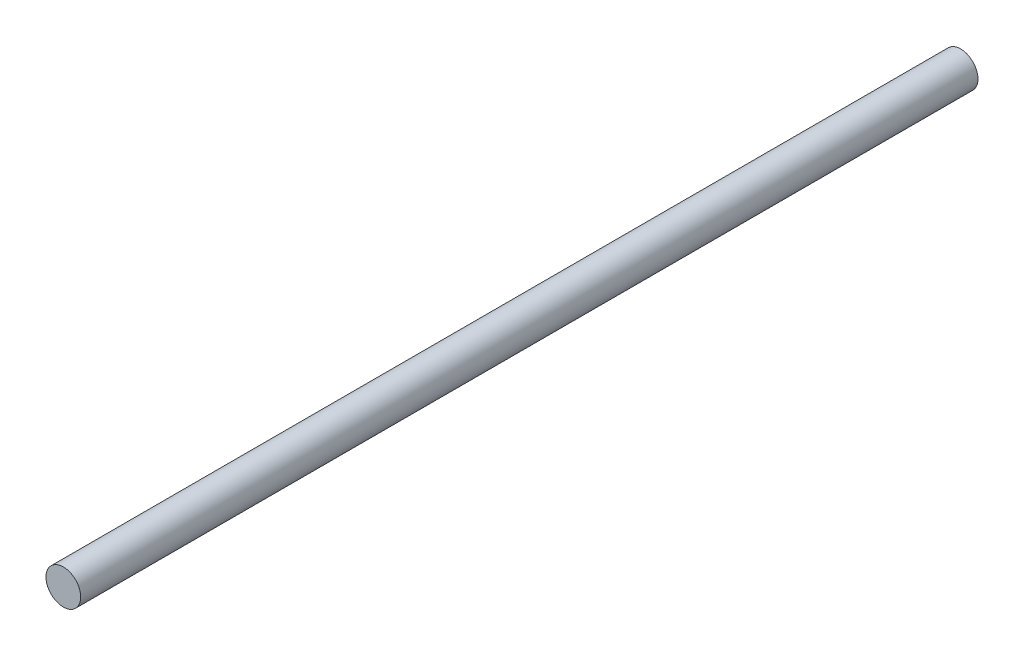
ISO-10303-21;
HEADER;
FILE_DESCRIPTION(('STEP AP214'),'2;1');
FILE_NAME('part.step','',(''),(''),'','','');
FILE_SCHEMA(('AUTOMOTIVE_DESIGN { 1 0 10303 214 1 1 1 1 }'));
ENDSEC;
DATA;
#1=APPLICATION_CONTEXT('core data for automotive mechanical design processes');
#2=APPLICATION_PROTOCOL_DEFINITION('international standard','automotive_design',2000,#1);
#3=PRODUCT_CONTEXT('',#1,'mechanical');
#4=PRODUCT('Part','Part','',(#3));
#5=PRODUCT_RELATED_PRODUCT_CATEGORY('part','',(#4));
#6=PRODUCT_DEFINITION_FORMATION('','',#4);
#7=PRODUCT_DEFINITION_CONTEXT('part definition',#1,'design');
#8=PRODUCT_DEFINITION('design','',#6,#7);
#9=PRODUCT_DEFINITION_SHAPE('','',#8);
#10=(LENGTH_UNIT() NAMED_UNIT(*) SI_UNIT(.MILLI.,.METRE.));
#11=(NAMED_UNIT(*) PLANE_ANGLE_UNIT() SI_UNIT($,.RADIAN.));
#12=(NAMED_UNIT(*) SI_UNIT($,.STERADIAN.) SOLID_ANGLE_UNIT());
#13=UNCERTAINTY_MEASURE_WITH_UNIT(LENGTH_MEASURE(1.E-05),#10,'distance_accuracy_value','');
#14=(GEOMETRIC_REPRESENTATION_CONTEXT(3) GLOBAL_UNCERTAINTY_ASSIGNED_CONTEXT((#13)) GLOBAL_UNIT_ASSIGNED_CONTEXT((#10,
#11,#12)) REPRESENTATION_CONTEXT('',''));
#15=CARTESIAN_POINT('',(0.,0.,0.));
#16=DIRECTION('',(0.,0.,1.));
#17=DIRECTION('',(1.,0.,0.));
#18=AXIS2_PLACEMENT_3D('',#15,#16,#17);
#19=CARTESIAN_POINT('',(0.,0.,310.));
#20=DIRECTION('',(0.,0.,-1.));
#21=DIRECTION('',(-1.,0.,0.));
#22=AXIS2_PLACEMENT_3D('',#19,#20,#21);
#23=CYLINDRICAL_SURFACE('',#22,6.);
#24=CARTESIAN_POINT('',(0.,0.,310.));
#25=DIRECTION('',(0.,0.,1.));
#26=DIRECTION('',(1.,0.,0.));
#27=AXIS2_PLACEMENT_3D('',#24,#25,#26);
#28=CIRCLE('',#27,6.);
#29=CARTESIAN_POINT('',(6.,0.,310.));
#30=VERTEX_POINT('',#29);
#31=EDGE_CURVE('E10',#30,#30,#28,.T.);
#32=ORIENTED_EDGE('',*,*,#31,.F.);
#33=EDGE_LOOP('',(#32));
#34=FACE_BOUND('',#33,.T.);
#35=CARTESIAN_POINT('',(0.,0.,0.));
#36=DIRECTION('',(0.,0.,1.));
#37=DIRECTION('',(1.,0.,0.));
#38=AXIS2_PLACEMENT_3D('',#35,#36,#37);
#39=CIRCLE('',#38,6.);
#40=CARTESIAN_POINT('',(6.,0.,0.));
#41=VERTEX_POINT('',#40);
#42=EDGE_CURVE('E33',#41,#41,#39,.T.);
#43=ORIENTED_EDGE('',*,*,#42,.T.);
#44=EDGE_LOOP('',(#43));
#45=FACE_BOUND('',#44,.T.);
#46=ADVANCED_FACE('F30',(#34,#45),#23,.T.);
#47=CARTESIAN_POINT('',(0.,0.,310.));
#48=DIRECTION('',(0.,0.,1.));
#49=DIRECTION('',(1.,0.,0.));
#50=AXIS2_PLACEMENT_3D('',#47,#48,#49);
#51=PLANE('',#50);
#52=ORIENTED_EDGE('',*,*,#31,.T.);
#53=EDGE_LOOP('',(#52));
#54=FACE_BOUND('',#53,.T.);
#55=ADVANCED_FACE('F45',(#54),#51,.T.);
#56=CARTESIAN_POINT('',(0.,0.,0.));
#57=DIRECTION('',(0.,0.,1.));
#58=DIRECTION('',(1.,0.,0.));
#59=AXIS2_PLACEMENT_3D('',#56,#57,#58);
#60=PLANE('',#59);
#61=ORIENTED_EDGE('',*,*,#42,.F.);
#62=EDGE_LOOP('',(#61));
#63=FACE_BOUND('',#62,.T.);
#64=ADVANCED_FACE('F43',(#63),#60,.F.);
#65=CLOSED_SHELL('',(#46,#55,#64));
#66=MANIFOLD_SOLID_BREP('B2',#65);
#67=ADVANCED_BREP_SHAPE_REPRESENTATION('',(#18,#66),#14);
#68=SHAPE_DEFINITION_REPRESENTATION(#9,#67);
ENDSEC;
END-ISO-10303-21;
